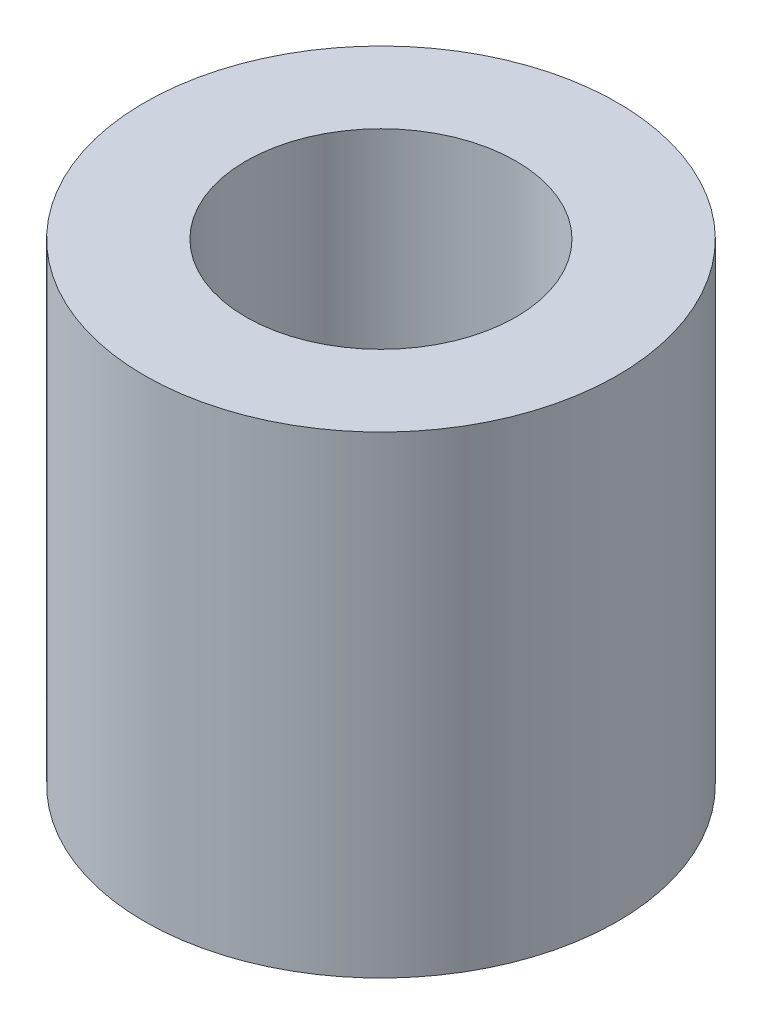
ISO-10303-21;
HEADER;
FILE_DESCRIPTION(('STEP AP214'),'2;1');
FILE_NAME('part.step','',(''),(''),'','','');
FILE_SCHEMA(('AUTOMOTIVE_DESIGN { 1 0 10303 214 1 1 1 1 }'));
ENDSEC;
DATA;
#1=APPLICATION_CONTEXT('core data for automotive mechanical design processes');
#2=APPLICATION_PROTOCOL_DEFINITION('international standard','automotive_design',2000,#1);
#3=PRODUCT_CONTEXT('',#1,'mechanical');
#4=PRODUCT('Part','Part','',(#3));
#5=PRODUCT_RELATED_PRODUCT_CATEGORY('part','',(#4));
#6=PRODUCT_DEFINITION_FORMATION('','',#4);
#7=PRODUCT_DEFINITION_CONTEXT('part definition',#1,'design');
#8=PRODUCT_DEFINITION('design','',#6,#7);
#9=PRODUCT_DEFINITION_SHAPE('','',#8);
#10=(LENGTH_UNIT() NAMED_UNIT(*) SI_UNIT(.MILLI.,.METRE.));
#11=(NAMED_UNIT(*) PLANE_ANGLE_UNIT() SI_UNIT($,.RADIAN.));
#12=(NAMED_UNIT(*) SI_UNIT($,.STERADIAN.) SOLID_ANGLE_UNIT());
#13=UNCERTAINTY_MEASURE_WITH_UNIT(LENGTH_MEASURE(1.E-05),#10,'distance_accuracy_value','');
#14=(GEOMETRIC_REPRESENTATION_CONTEXT(3) GLOBAL_UNCERTAINTY_ASSIGNED_CONTEXT((#13)) GLOBAL_UNIT_ASSIGNED_CONTEXT((#10,
#11,#12)) REPRESENTATION_CONTEXT('',''));
#15=CARTESIAN_POINT('',(0.,0.,0.));
#16=DIRECTION('',(0.,0.,1.));
#17=DIRECTION('',(1.,0.,0.));
#18=AXIS2_PLACEMENT_3D('',#15,#16,#17);
#19=CARTESIAN_POINT('',(0.,257.25,0.));
#20=DIRECTION('',(0.,1.,0.));
#21=DIRECTION('',(0.,0.,1.));
#22=AXIS2_PLACEMENT_3D('',#19,#20,#21);
#23=PLANE('',#22);
#24=CARTESIAN_POINT('',(0.,257.25,0.));
#25=DIRECTION('',(0.,1.,0.));
#26=DIRECTION('',(0.,0.,1.));
#27=AXIS2_PLACEMENT_3D('',#24,#25,#26);
#28=CIRCLE('',#27,82.25);
#29=CARTESIAN_POINT('',(0.,257.25,82.25));
#30=VERTEX_POINT('',#29);
#31=EDGE_CURVE('E10',#30,#30,#28,.T.);
#32=ORIENTED_EDGE('',*,*,#31,.T.);
#33=EDGE_LOOP('',(#32));
#34=FACE_BOUND('',#33,.T.);
#35=CARTESIAN_POINT('',(0.,257.25,0.));
#36=DIRECTION('',(0.,1.,0.));
#37=DIRECTION('',(0.,0.,1.));
#38=AXIS2_PLACEMENT_3D('',#35,#36,#37);
#39=CIRCLE('',#38,47.);
#40=CARTESIAN_POINT('',(0.,257.25,47.));
#41=VERTEX_POINT('',#40);
#42=EDGE_CURVE('E47',#41,#41,#39,.T.);
#43=ORIENTED_EDGE('',*,*,#42,.F.);
#44=EDGE_LOOP('',(#43));
#45=FACE_BOUND('',#44,.T.);
#46=ADVANCED_FACE('F36',(#34,#45),#23,.T.);
#47=CARTESIAN_POINT('',(0.,92.75,0.));
#48=DIRECTION('',(0.,1.,0.));
#49=DIRECTION('',(0.,0.,1.));
#50=AXIS2_PLACEMENT_3D('',#47,#48,#49);
#51=PLANE('',#50);
#52=CARTESIAN_POINT('',(0.,92.75,0.));
#53=DIRECTION('',(0.,1.,0.));
#54=DIRECTION('',(0.,0.,1.));
#55=AXIS2_PLACEMENT_3D('',#52,#53,#54);
#56=CIRCLE('',#55,82.25);
#57=CARTESIAN_POINT('',(0.,92.75,82.25));
#58=VERTEX_POINT('',#57);
#59=EDGE_CURVE('E40',#58,#58,#56,.T.);
#60=ORIENTED_EDGE('',*,*,#59,.F.);
#61=EDGE_LOOP('',(#60));
#62=FACE_BOUND('',#61,.T.);
#63=CARTESIAN_POINT('',(0.,92.75,0.));
#64=DIRECTION('',(0.,1.,0.));
#65=DIRECTION('',(0.,0.,1.));
#66=AXIS2_PLACEMENT_3D('',#63,#64,#65);
#67=CIRCLE('',#66,47.);
#68=CARTESIAN_POINT('',(0.,92.75,47.));
#69=VERTEX_POINT('',#68);
#70=EDGE_CURVE('E49',#69,#69,#67,.T.);
#71=ORIENTED_EDGE('',*,*,#70,.T.);
#72=EDGE_LOOP('',(#71));
#73=FACE_BOUND('',#72,.T.);
#74=ADVANCED_FACE('F59',(#62,#73),#51,.F.);
#75=CARTESIAN_POINT('',(0.,257.25,0.));
#76=DIRECTION('',(0.,-1.,0.));
#77=DIRECTION('',(0.,0.,-1.));
#78=AXIS2_PLACEMENT_3D('',#75,#76,#77);
#79=CYLINDRICAL_SURFACE('',#78,82.25);
#80=ORIENTED_EDGE('',*,*,#31,.F.);
#81=EDGE_LOOP('',(#80));
#82=FACE_BOUND('',#81,.T.);
#83=ORIENTED_EDGE('',*,*,#59,.T.);
#84=EDGE_LOOP('',(#83));
#85=FACE_BOUND('',#84,.T.);
#86=ADVANCED_FACE('F38',(#82,#85),#79,.T.);
#87=CARTESIAN_POINT('',(0.,257.25,0.));
#88=DIRECTION('',(0.,-1.,0.));
#89=DIRECTION('',(0.,0.,-1.));
#90=AXIS2_PLACEMENT_3D('',#87,#88,#89);
#91=CYLINDRICAL_SURFACE('',#90,47.);
#92=ORIENTED_EDGE('',*,*,#42,.T.);
#93=EDGE_LOOP('',(#92));
#94=FACE_BOUND('',#93,.T.);
#95=ORIENTED_EDGE('',*,*,#70,.F.);
#96=EDGE_LOOP('',(#95));
#97=FACE_BOUND('',#96,.T.);
#98=ADVANCED_FACE('F55',(#94,#97),#91,.F.);
#99=CLOSED_SHELL('',(#46,#74,#86,#98));
#100=MANIFOLD_SOLID_BREP('B2',#99);
#101=ADVANCED_BREP_SHAPE_REPRESENTATION('',(#18,#100),#14);
#102=SHAPE_DEFINITION_REPRESENTATION(#9,#101);
ENDSEC;
END-ISO-10303-21;
